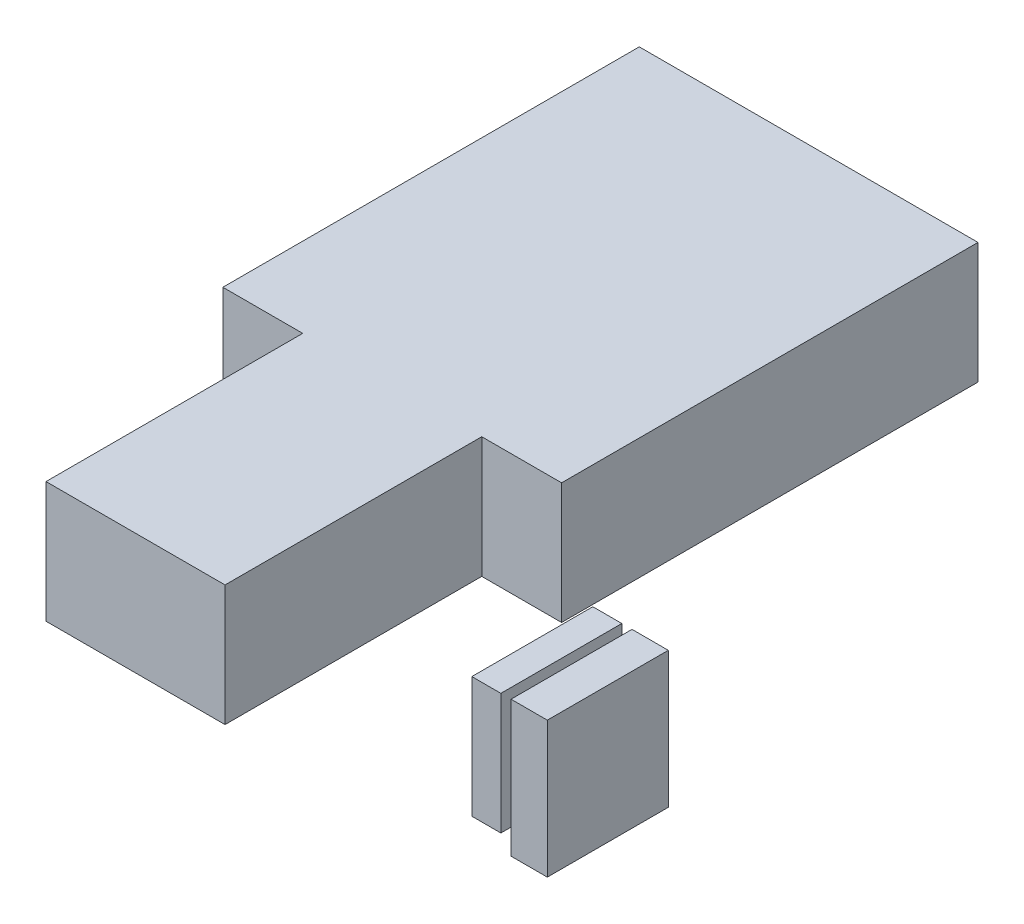
ISO-10303-21;
HEADER;
FILE_DESCRIPTION(('STEP AP214'),'2;1');
FILE_NAME('part.step','',(''),(''),'','','');
FILE_SCHEMA(('AUTOMOTIVE_DESIGN { 1 0 10303 214 1 1 1 1 }'));
ENDSEC;
DATA;
#1=APPLICATION_CONTEXT('core data for automotive mechanical design processes');
#2=APPLICATION_PROTOCOL_DEFINITION('international standard','automotive_design',2000,#1);
#3=PRODUCT_CONTEXT('',#1,'mechanical');
#4=PRODUCT('Part','Part','',(#3));
#5=PRODUCT_RELATED_PRODUCT_CATEGORY('part','',(#4));
#6=PRODUCT_DEFINITION_FORMATION('','',#4);
#7=PRODUCT_DEFINITION_CONTEXT('part definition',#1,'design');
#8=PRODUCT_DEFINITION('design','',#6,#7);
#9=PRODUCT_DEFINITION_SHAPE('','',#8);
#10=(LENGTH_UNIT() NAMED_UNIT(*) SI_UNIT(.MILLI.,.METRE.));
#11=(NAMED_UNIT(*) PLANE_ANGLE_UNIT() SI_UNIT($,.RADIAN.));
#12=(NAMED_UNIT(*) SI_UNIT($,.STERADIAN.) SOLID_ANGLE_UNIT());
#13=UNCERTAINTY_MEASURE_WITH_UNIT(LENGTH_MEASURE(1.E-05),#10,'distance_accuracy_value','');
#14=(GEOMETRIC_REPRESENTATION_CONTEXT(3) GLOBAL_UNCERTAINTY_ASSIGNED_CONTEXT((#13)) GLOBAL_UNIT_ASSIGNED_CONTEXT((#10,
#11,#12)) REPRESENTATION_CONTEXT('',''));
#15=CARTESIAN_POINT('',(0.,0.,0.));
#16=DIRECTION('',(0.,0.,1.));
#17=DIRECTION('',(1.,0.,0.));
#18=AXIS2_PLACEMENT_3D('',#15,#16,#17);
#19=CARTESIAN_POINT('',(-98.5,9.39999999999999,-34.55));
#20=DIRECTION('',(1.,0.,0.));
#21=DIRECTION('',(0.,0.,-1.));
#22=AXIS2_PLACEMENT_3D('',#19,#20,#21);
#23=PLANE('',#22);
#24=DIRECTION('',(0.,0.,1.));
#25=VECTOR('',#24,1.);
#26=CARTESIAN_POINT('',(-98.5,-15.6,-34.55));
#27=LINE('',#26,#25);
#28=CARTESIAN_POINT('',(-98.5,-15.6,-120.6));
#29=VERTEX_POINT('',#28);
#30=CARTESIAN_POINT('',(-98.5,-15.6,-34.55));
#31=VERTEX_POINT('',#30);
#32=EDGE_CURVE('E141',#29,#31,#27,.T.);
#33=ORIENTED_EDGE('',*,*,#32,.T.);
#34=DIRECTION('',(0.,-1.,0.));
#35=VECTOR('',#34,1.);
#36=CARTESIAN_POINT('',(-98.5,9.39999999999999,-34.55));
#37=LINE('',#36,#35);
#38=CARTESIAN_POINT('',(-98.5,9.39999999999999,-34.55));
#39=VERTEX_POINT('',#38);
#40=EDGE_CURVE('E12',#39,#31,#37,.T.);
#41=ORIENTED_EDGE('',*,*,#40,.F.);
#42=DIRECTION('',(0.,0.,1.));
#43=VECTOR('',#42,1.);
#44=CARTESIAN_POINT('',(-98.5,9.39999999999999,-34.55));
#45=LINE('',#44,#43);
#46=CARTESIAN_POINT('',(-98.5,9.39999999999999,-120.6));
#47=VERTEX_POINT('',#46);
#48=EDGE_CURVE('E155',#47,#39,#45,.T.);
#49=ORIENTED_EDGE('',*,*,#48,.F.);
#50=DIRECTION('',(0.,-1.,0.));
#51=VECTOR('',#50,1.);
#52=CARTESIAN_POINT('',(-98.5,9.39999999999999,-120.6));
#53=LINE('',#52,#51);
#54=EDGE_CURVE('E137',#47,#29,#53,.T.);
#55=ORIENTED_EDGE('',*,*,#54,.T.);
#56=EDGE_LOOP('',(#33,#41,#49,#55));
#57=FACE_BOUND('',#56,.T.);
#58=ADVANCED_FACE('F45',(#57),#23,.F.);
#59=CARTESIAN_POINT('',(-82.,9.39999999999999,-34.55));
#60=DIRECTION('',(0.,0.,-1.));
#61=DIRECTION('',(-1.,0.,0.));
#62=AXIS2_PLACEMENT_3D('',#59,#60,#61);
#63=PLANE('',#62);
#64=DIRECTION('',(1.,0.,0.));
#65=VECTOR('',#64,1.);
#66=CARTESIAN_POINT('',(-82.,-15.6,-34.55));
#67=LINE('',#66,#65);
#68=CARTESIAN_POINT('',(-82.,-15.6,-34.55));
#69=VERTEX_POINT('',#68);
#70=EDGE_CURVE('E144',#31,#69,#67,.T.);
#71=ORIENTED_EDGE('',*,*,#70,.T.);
#72=DIRECTION('',(0.,-1.,0.));
#73=VECTOR('',#72,1.);
#74=CARTESIAN_POINT('',(-82.,9.39999999999999,-34.55));
#75=LINE('',#74,#73);
#76=CARTESIAN_POINT('',(-82.,9.39999999999999,-34.55));
#77=VERTEX_POINT('',#76);
#78=EDGE_CURVE('E53',#77,#69,#75,.T.);
#79=ORIENTED_EDGE('',*,*,#78,.F.);
#80=DIRECTION('',(1.,0.,0.));
#81=VECTOR('',#80,1.);
#82=CARTESIAN_POINT('',(-82.,9.39999999999999,-34.55));
#83=LINE('',#82,#81);
#84=EDGE_CURVE('E104',#39,#77,#83,.T.);
#85=ORIENTED_EDGE('',*,*,#84,.F.);
#86=ORIENTED_EDGE('',*,*,#40,.T.);
#87=EDGE_LOOP('',(#71,#79,#85,#86));
#88=FACE_BOUND('',#87,.T.);
#89=ADVANCED_FACE('F190',(#88),#63,.F.);
#90=CARTESIAN_POINT('',(-82.,9.39999999999999,18.5));
#91=DIRECTION('',(1.,0.,0.));
#92=DIRECTION('',(0.,0.,-1.));
#93=AXIS2_PLACEMENT_3D('',#90,#91,#92);
#94=PLANE('',#93);
#95=DIRECTION('',(0.,0.,1.));
#96=VECTOR('',#95,1.);
#97=CARTESIAN_POINT('',(-82.,-15.6,18.5));
#98=LINE('',#97,#96);
#99=CARTESIAN_POINT('',(-82.,-15.6,18.5));
#100=VERTEX_POINT('',#99);
#101=EDGE_CURVE('E146',#69,#100,#98,.T.);
#102=ORIENTED_EDGE('',*,*,#101,.T.);
#103=DIRECTION('',(0.,-1.,0.));
#104=VECTOR('',#103,1.);
#105=CARTESIAN_POINT('',(-82.,9.39999999999999,18.5));
#106=LINE('',#105,#104);
#107=CARTESIAN_POINT('',(-82.,9.39999999999999,18.5));
#108=VERTEX_POINT('',#107);
#109=EDGE_CURVE('E162',#108,#100,#106,.T.);
#110=ORIENTED_EDGE('',*,*,#109,.F.);
#111=DIRECTION('',(0.,0.,1.));
#112=VECTOR('',#111,1.);
#113=CARTESIAN_POINT('',(-82.,9.39999999999999,18.5));
#114=LINE('',#113,#112);
#115=EDGE_CURVE('E170',#77,#108,#114,.T.);
#116=ORIENTED_EDGE('',*,*,#115,.F.);
#117=ORIENTED_EDGE('',*,*,#78,.T.);
#118=EDGE_LOOP('',(#102,#110,#116,#117));
#119=FACE_BOUND('',#118,.T.);
#120=ADVANCED_FACE('F168',(#119),#94,.F.);
#121=CARTESIAN_POINT('',(-45.,9.39999999999999,18.5));
#122=DIRECTION('',(0.,0.,-1.));
#123=DIRECTION('',(-1.,0.,0.));
#124=AXIS2_PLACEMENT_3D('',#121,#122,#123);
#125=PLANE('',#124);
#126=DIRECTION('',(1.,0.,0.));
#127=VECTOR('',#126,1.);
#128=CARTESIAN_POINT('',(-45.,-15.6,18.5));
#129=LINE('',#128,#127);
#130=CARTESIAN_POINT('',(-45.,-15.6,18.5));
#131=VERTEX_POINT('',#130);
#132=EDGE_CURVE('E148',#100,#131,#129,.T.);
#133=ORIENTED_EDGE('',*,*,#132,.T.);
#134=DIRECTION('',(0.,-1.,0.));
#135=VECTOR('',#134,1.);
#136=CARTESIAN_POINT('',(-45.,9.39999999999999,18.5));
#137=LINE('',#136,#135);
#138=CARTESIAN_POINT('',(-45.,9.39999999999999,18.5));
#139=VERTEX_POINT('',#138);
#140=EDGE_CURVE('E159',#139,#131,#137,.T.);
#141=ORIENTED_EDGE('',*,*,#140,.F.);
#142=DIRECTION('',(1.,0.,0.));
#143=VECTOR('',#142,1.);
#144=CARTESIAN_POINT('',(-45.,9.39999999999999,18.5));
#145=LINE('',#144,#143);
#146=EDGE_CURVE('E182',#108,#139,#145,.T.);
#147=ORIENTED_EDGE('',*,*,#146,.F.);
#148=ORIENTED_EDGE('',*,*,#109,.T.);
#149=EDGE_LOOP('',(#133,#141,#147,#148));
#150=FACE_BOUND('',#149,.T.);
#151=ADVANCED_FACE('F178',(#150),#125,.F.);
#152=CARTESIAN_POINT('',(-45.,9.39999999999999,-34.55));
#153=DIRECTION('',(-1.,0.,0.));
#154=DIRECTION('',(0.,0.,1.));
#155=AXIS2_PLACEMENT_3D('',#152,#153,#154);
#156=PLANE('',#155);
#157=DIRECTION('',(0.,0.,-1.));
#158=VECTOR('',#157,1.);
#159=CARTESIAN_POINT('',(-45.,-15.6,-34.55));
#160=LINE('',#159,#158);
#161=CARTESIAN_POINT('',(-45.,-15.6,-34.55));
#162=VERTEX_POINT('',#161);
#163=EDGE_CURVE('E150',#131,#162,#160,.T.);
#164=ORIENTED_EDGE('',*,*,#163,.T.);
#165=DIRECTION('',(0.,-1.,0.));
#166=VECTOR('',#165,1.);
#167=CARTESIAN_POINT('',(-45.,9.39999999999999,-34.55));
#168=LINE('',#167,#166);
#169=CARTESIAN_POINT('',(-45.,9.39999999999999,-34.55));
#170=VERTEX_POINT('',#169);
#171=EDGE_CURVE('E132',#170,#162,#168,.T.);
#172=ORIENTED_EDGE('',*,*,#171,.F.);
#173=DIRECTION('',(0.,0.,-1.));
#174=VECTOR('',#173,1.);
#175=CARTESIAN_POINT('',(-45.,9.39999999999999,-34.55));
#176=LINE('',#175,#174);
#177=EDGE_CURVE('E123',#139,#170,#176,.T.);
#178=ORIENTED_EDGE('',*,*,#177,.F.);
#179=ORIENTED_EDGE('',*,*,#140,.T.);
#180=EDGE_LOOP('',(#164,#172,#178,#179));
#181=FACE_BOUND('',#180,.T.);
#182=ADVANCED_FACE('F181',(#181),#156,.F.);
#183=CARTESIAN_POINT('',(-28.5,9.39999999999999,-34.55));
#184=DIRECTION('',(0.,0.,-1.));
#185=DIRECTION('',(-1.,0.,0.));
#186=AXIS2_PLACEMENT_3D('',#183,#184,#185);
#187=PLANE('',#186);
#188=DIRECTION('',(1.,0.,0.));
#189=VECTOR('',#188,1.);
#190=CARTESIAN_POINT('',(-28.5,-15.6,-34.55));
#191=LINE('',#190,#189);
#192=CARTESIAN_POINT('',(-28.5,-15.6,-34.55));
#193=VERTEX_POINT('',#192);
#194=EDGE_CURVE('E131',#162,#193,#191,.T.);
#195=ORIENTED_EDGE('',*,*,#194,.T.);
#196=DIRECTION('',(0.,-1.,0.));
#197=VECTOR('',#196,1.);
#198=CARTESIAN_POINT('',(-28.5,9.39999999999999,-34.55));
#199=LINE('',#198,#197);
#200=CARTESIAN_POINT('',(-28.5,9.39999999999999,-34.55));
#201=VERTEX_POINT('',#200);
#202=EDGE_CURVE('E128',#201,#193,#199,.T.);
#203=ORIENTED_EDGE('',*,*,#202,.F.);
#204=DIRECTION('',(1.,0.,0.));
#205=VECTOR('',#204,1.);
#206=CARTESIAN_POINT('',(-28.5,9.39999999999999,-34.55));
#207=LINE('',#206,#205);
#208=EDGE_CURVE('E117',#170,#201,#207,.T.);
#209=ORIENTED_EDGE('',*,*,#208,.F.);
#210=ORIENTED_EDGE('',*,*,#171,.T.);
#211=EDGE_LOOP('',(#195,#203,#209,#210));
#212=FACE_BOUND('',#211,.T.);
#213=ADVANCED_FACE('F129',(#212),#187,.F.);
#214=CARTESIAN_POINT('',(-28.5,9.39999999999999,-120.6));
#215=DIRECTION('',(-1.,0.,0.));
#216=DIRECTION('',(0.,0.,1.));
#217=AXIS2_PLACEMENT_3D('',#214,#215,#216);
#218=PLANE('',#217);
#219=DIRECTION('',(0.,0.,-1.));
#220=VECTOR('',#219,1.);
#221=CARTESIAN_POINT('',(-28.5,-15.6,-120.6));
#222=LINE('',#221,#220);
#223=CARTESIAN_POINT('',(-28.5,-15.6,-120.6));
#224=VERTEX_POINT('',#223);
#225=EDGE_CURVE('E90',#193,#224,#222,.T.);
#226=ORIENTED_EDGE('',*,*,#225,.T.);
#227=DIRECTION('',(0.,-1.,0.));
#228=VECTOR('',#227,1.);
#229=CARTESIAN_POINT('',(-28.5,9.39999999999999,-120.6));
#230=LINE('',#229,#228);
#231=CARTESIAN_POINT('',(-28.5,9.39999999999999,-120.6));
#232=VERTEX_POINT('',#231);
#233=EDGE_CURVE('E133',#232,#224,#230,.T.);
#234=ORIENTED_EDGE('',*,*,#233,.F.);
#235=DIRECTION('',(0.,0.,-1.));
#236=VECTOR('',#235,1.);
#237=CARTESIAN_POINT('',(-28.5,9.39999999999999,-120.6));
#238=LINE('',#237,#236);
#239=EDGE_CURVE('E121',#201,#232,#238,.T.);
#240=ORIENTED_EDGE('',*,*,#239,.F.);
#241=ORIENTED_EDGE('',*,*,#202,.T.);
#242=EDGE_LOOP('',(#226,#234,#240,#241));
#243=FACE_BOUND('',#242,.T.);
#244=ADVANCED_FACE('F135',(#243),#218,.F.);
#245=CARTESIAN_POINT('',(-98.5,9.39999999999999,-120.6));
#246=DIRECTION('',(0.,0.,1.));
#247=DIRECTION('',(1.,0.,0.));
#248=AXIS2_PLACEMENT_3D('',#245,#246,#247);
#249=PLANE('',#248);
#250=DIRECTION('',(-1.,0.,0.));
#251=VECTOR('',#250,1.);
#252=CARTESIAN_POINT('',(-98.5,-15.6,-120.6));
#253=LINE('',#252,#251);
#254=EDGE_CURVE('E96',#224,#29,#253,.T.);
#255=ORIENTED_EDGE('',*,*,#254,.T.);
#256=ORIENTED_EDGE('',*,*,#54,.F.);
#257=DIRECTION('',(-1.,0.,0.));
#258=VECTOR('',#257,1.);
#259=CARTESIAN_POINT('',(-98.5,9.39999999999999,-120.6));
#260=LINE('',#259,#258);
#261=EDGE_CURVE('E61',#232,#47,#260,.T.);
#262=ORIENTED_EDGE('',*,*,#261,.F.);
#263=ORIENTED_EDGE('',*,*,#233,.T.);
#264=EDGE_LOOP('',(#255,#256,#262,#263));
#265=FACE_BOUND('',#264,.T.);
#266=ADVANCED_FACE('F206',(#265),#249,.F.);
#267=CARTESIAN_POINT('',(0.,9.39999999999999,0.));
#268=DIRECTION('',(0.,-1.,0.));
#269=DIRECTION('',(0.,0.,-1.));
#270=AXIS2_PLACEMENT_3D('',#267,#268,#269);
#271=PLANE('',#270);
#272=ORIENTED_EDGE('',*,*,#48,.T.);
#273=ORIENTED_EDGE('',*,*,#84,.T.);
#274=ORIENTED_EDGE('',*,*,#115,.T.);
#275=ORIENTED_EDGE('',*,*,#146,.T.);
#276=ORIENTED_EDGE('',*,*,#177,.T.);
#277=ORIENTED_EDGE('',*,*,#208,.T.);
#278=ORIENTED_EDGE('',*,*,#239,.T.);
#279=ORIENTED_EDGE('',*,*,#261,.T.);
#280=EDGE_LOOP('',(#272,#273,#274,#275,#276,#277,#278,#279));
#281=FACE_BOUND('',#280,.T.);
#282=ADVANCED_FACE('F119',(#281),#271,.F.);
#283=CARTESIAN_POINT('',(0.,-15.6,0.));
#284=DIRECTION('',(0.,-1.,0.));
#285=DIRECTION('',(0.,0.,-1.));
#286=AXIS2_PLACEMENT_3D('',#283,#284,#285);
#287=PLANE('',#286);
#288=ORIENTED_EDGE('',*,*,#32,.F.);
#289=ORIENTED_EDGE('',*,*,#254,.F.);
#290=ORIENTED_EDGE('',*,*,#225,.F.);
#291=ORIENTED_EDGE('',*,*,#194,.F.);
#292=ORIENTED_EDGE('',*,*,#163,.F.);
#293=ORIENTED_EDGE('',*,*,#132,.F.);
#294=ORIENTED_EDGE('',*,*,#101,.F.);
#295=ORIENTED_EDGE('',*,*,#70,.F.);
#296=EDGE_LOOP('',(#288,#289,#290,#291,#292,#293,#294,#295));
#297=FACE_BOUND('',#296,.T.);
#298=ADVANCED_FACE('F174',(#297),#287,.T.);
#299=CLOSED_SHELL('',(#58,#89,#120,#151,#182,#213,#244,#266,#282,#298));
#300=MANIFOLD_SOLID_BREP('B2',#299);
#301=CARTESIAN_POINT('',(8.1,-15.6,-12.5));
#302=DIRECTION('',(0.,0.,1.));
#303=DIRECTION('',(1.,0.,0.));
#304=AXIS2_PLACEMENT_3D('',#301,#302,#303);
#305=PLANE('',#304);
#306=DIRECTION('',(0.,-1.,0.));
#307=VECTOR('',#306,1.);
#308=CARTESIAN_POINT('',(15.6,-15.6,-12.5));
#309=LINE('',#308,#307);
#310=CARTESIAN_POINT('',(15.6,12.5,-12.5));
#311=VERTEX_POINT('',#310);
#312=CARTESIAN_POINT('',(15.6,-15.6,-12.5));
#313=VERTEX_POINT('',#312);
#314=EDGE_CURVE('E344',#311,#313,#309,.T.);
#315=ORIENTED_EDGE('',*,*,#314,.T.);
#316=DIRECTION('',(1.,0.,0.));
#317=VECTOR('',#316,1.);
#318=CARTESIAN_POINT('',(8.1,-15.6,-12.5));
#319=LINE('',#318,#317);
#320=CARTESIAN_POINT('',(8.1,-15.6,-12.5));
#321=VERTEX_POINT('',#320);
#322=EDGE_CURVE('E43',#321,#313,#319,.T.);
#323=ORIENTED_EDGE('',*,*,#322,.F.);
#324=DIRECTION('',(0.,-1.,0.));
#325=VECTOR('',#324,1.);
#326=CARTESIAN_POINT('',(8.1,-15.6,-12.5));
#327=LINE('',#326,#325);
#328=CARTESIAN_POINT('',(8.1,12.5,-12.5));
#329=VERTEX_POINT('',#328);
#330=EDGE_CURVE('E332',#329,#321,#327,.T.);
#331=ORIENTED_EDGE('',*,*,#330,.F.);
#332=DIRECTION('',(1.,0.,0.));
#333=VECTOR('',#332,1.);
#334=CARTESIAN_POINT('',(8.1,12.5,-12.5));
#335=LINE('',#334,#333);
#336=EDGE_CURVE('E340',#329,#311,#335,.T.);
#337=ORIENTED_EDGE('',*,*,#336,.T.);
#338=EDGE_LOOP('',(#315,#323,#331,#337));
#339=FACE_BOUND('',#338,.T.);
#340=ADVANCED_FACE('F281',(#339),#305,.F.);
#341=CARTESIAN_POINT('',(8.1,-15.6,12.5));
#342=DIRECTION('',(0.,1.,0.));
#343=DIRECTION('',(0.,0.,1.));
#344=AXIS2_PLACEMENT_3D('',#341,#342,#343);
#345=PLANE('',#344);
#346=DIRECTION('',(0.,0.,1.));
#347=VECTOR('',#346,1.);
#348=CARTESIAN_POINT('',(15.6,-15.6,12.5));
#349=LINE('',#348,#347);
#350=CARTESIAN_POINT('',(15.6,-15.6,12.5));
#351=VERTEX_POINT('',#350);
#352=EDGE_CURVE('E336',#313,#351,#349,.T.);
#353=ORIENTED_EDGE('',*,*,#352,.T.);
#354=DIRECTION('',(1.,0.,0.));
#355=VECTOR('',#354,1.);
#356=CARTESIAN_POINT('',(8.1,-15.6,12.5));
#357=LINE('',#356,#355);
#358=CARTESIAN_POINT('',(8.1,-15.6,12.5));
#359=VERTEX_POINT('',#358);
#360=EDGE_CURVE('E289',#359,#351,#357,.T.);
#361=ORIENTED_EDGE('',*,*,#360,.F.);
#362=DIRECTION('',(0.,0.,1.));
#363=VECTOR('',#362,1.);
#364=CARTESIAN_POINT('',(8.1,-15.6,12.5));
#365=LINE('',#364,#363);
#366=EDGE_CURVE('E327',#321,#359,#365,.T.);
#367=ORIENTED_EDGE('',*,*,#366,.F.);
#368=ORIENTED_EDGE('',*,*,#322,.T.);
#369=EDGE_LOOP('',(#353,#361,#367,#368));
#370=FACE_BOUND('',#369,.T.);
#371=ADVANCED_FACE('F335',(#370),#345,.F.);
#372=CARTESIAN_POINT('',(8.1,12.5,12.5));
#373=DIRECTION('',(0.,0.,-1.));
#374=DIRECTION('',(0.,1.,0.));
#375=AXIS2_PLACEMENT_3D('',#372,#373,#374);
#376=PLANE('',#375);
#377=DIRECTION('',(0.,1.,0.));
#378=VECTOR('',#377,1.);
#379=CARTESIAN_POINT('',(15.6,12.5,12.5));
#380=LINE('',#379,#378);
#381=CARTESIAN_POINT('',(15.6,12.5,12.5));
#382=VERTEX_POINT('',#381);
#383=EDGE_CURVE('E314',#351,#382,#380,.T.);
#384=ORIENTED_EDGE('',*,*,#383,.T.);
#385=DIRECTION('',(1.,0.,0.));
#386=VECTOR('',#385,1.);
#387=CARTESIAN_POINT('',(8.1,12.5,12.5));
#388=LINE('',#387,#386);
#389=CARTESIAN_POINT('',(8.1,12.5,12.5));
#390=VERTEX_POINT('',#389);
#391=EDGE_CURVE('E337',#390,#382,#388,.T.);
#392=ORIENTED_EDGE('',*,*,#391,.F.);
#393=DIRECTION('',(0.,1.,0.));
#394=VECTOR('',#393,1.);
#395=CARTESIAN_POINT('',(8.1,12.5,12.5));
#396=LINE('',#395,#394);
#397=EDGE_CURVE('E330',#359,#390,#396,.T.);
#398=ORIENTED_EDGE('',*,*,#397,.F.);
#399=ORIENTED_EDGE('',*,*,#360,.T.);
#400=EDGE_LOOP('',(#384,#392,#398,#399));
#401=FACE_BOUND('',#400,.T.);
#402=ADVANCED_FACE('F338',(#401),#376,.F.);
#403=CARTESIAN_POINT('',(8.1,12.5,-12.5));
#404=DIRECTION('',(0.,-1.,0.));
#405=DIRECTION('',(0.,0.,-1.));
#406=AXIS2_PLACEMENT_3D('',#403,#404,#405);
#407=PLANE('',#406);
#408=DIRECTION('',(0.,0.,-1.));
#409=VECTOR('',#408,1.);
#410=CARTESIAN_POINT('',(15.6,12.5,-12.5));
#411=LINE('',#410,#409);
#412=EDGE_CURVE('E320',#382,#311,#411,.T.);
#413=ORIENTED_EDGE('',*,*,#412,.T.);
#414=ORIENTED_EDGE('',*,*,#336,.F.);
#415=DIRECTION('',(0.,0.,-1.));
#416=VECTOR('',#415,1.);
#417=CARTESIAN_POINT('',(8.1,12.5,-12.5));
#418=LINE('',#417,#416);
#419=EDGE_CURVE('E297',#390,#329,#418,.T.);
#420=ORIENTED_EDGE('',*,*,#419,.F.);
#421=ORIENTED_EDGE('',*,*,#391,.T.);
#422=EDGE_LOOP('',(#413,#414,#420,#421));
#423=FACE_BOUND('',#422,.T.);
#424=ADVANCED_FACE('F351',(#423),#407,.F.);
#425=CARTESIAN_POINT('',(8.1,0.,0.));
#426=DIRECTION('',(1.,0.,0.));
#427=DIRECTION('',(0.,0.,-1.));
#428=AXIS2_PLACEMENT_3D('',#425,#426,#427);
#429=PLANE('',#428);
#430=ORIENTED_EDGE('',*,*,#330,.T.);
#431=ORIENTED_EDGE('',*,*,#366,.T.);
#432=ORIENTED_EDGE('',*,*,#397,.T.);
#433=ORIENTED_EDGE('',*,*,#419,.T.);
#434=EDGE_LOOP('',(#430,#431,#432,#433));
#435=FACE_BOUND('',#434,.T.);
#436=ADVANCED_FACE('F328',(#435),#429,.F.);
#437=CARTESIAN_POINT('',(15.6,0.,0.));
#438=DIRECTION('',(1.,0.,0.));
#439=DIRECTION('',(0.,0.,-1.));
#440=AXIS2_PLACEMENT_3D('',#437,#438,#439);
#441=PLANE('',#440);
#442=ORIENTED_EDGE('',*,*,#314,.F.);
#443=ORIENTED_EDGE('',*,*,#412,.F.);
#444=ORIENTED_EDGE('',*,*,#383,.F.);
#445=ORIENTED_EDGE('',*,*,#352,.F.);
#446=EDGE_LOOP('',(#442,#443,#444,#445));
#447=FACE_BOUND('',#446,.T.);
#448=ADVANCED_FACE('F354',(#447),#441,.T.);
#449=CLOSED_SHELL('',(#340,#371,#402,#424,#436,#448));
#450=MANIFOLD_SOLID_BREP('B6_NOT_SHOWN',#449);
#451=CARTESIAN_POINT('',(6.,12.5,-12.5));
#452=DIRECTION('',(0.,0.,1.));
#453=DIRECTION('',(0.,-1.,0.));
#454=AXIS2_PLACEMENT_3D('',#451,#452,#453);
#455=PLANE('',#454);
#456=DIRECTION('',(0.,1.,0.));
#457=VECTOR('',#456,1.);
#458=CARTESIAN_POINT('',(0.,12.5,-12.5));
#459=LINE('',#458,#457);
#460=CARTESIAN_POINT('',(0.,-12.5,-12.5));
#461=VERTEX_POINT('',#460);
#462=CARTESIAN_POINT('',(0.,12.5,-12.5));
#463=VERTEX_POINT('',#462);
#464=EDGE_CURVE('E467',#461,#463,#459,.T.);
#465=ORIENTED_EDGE('',*,*,#464,.T.);
#466=DIRECTION('',(-1.,0.,0.));
#467=VECTOR('',#466,1.);
#468=CARTESIAN_POINT('',(6.,12.5,-12.5));
#469=LINE('',#468,#467);
#470=CARTESIAN_POINT('',(6.,12.5,-12.5));
#471=VERTEX_POINT('',#470);
#472=EDGE_CURVE('E279',#471,#463,#469,.T.);
#473=ORIENTED_EDGE('',*,*,#472,.F.);
#474=DIRECTION('',(0.,1.,0.));
#475=VECTOR('',#474,1.);
#476=CARTESIAN_POINT('',(6.,12.5,-12.5));
#477=LINE('',#476,#475);
#478=CARTESIAN_POINT('',(6.,-12.5,-12.5));
#479=VERTEX_POINT('',#478);
#480=EDGE_CURVE('E455',#479,#471,#477,.T.);
#481=ORIENTED_EDGE('',*,*,#480,.F.);
#482=DIRECTION('',(-1.,0.,0.));
#483=VECTOR('',#482,1.);
#484=CARTESIAN_POINT('',(6.,-12.5,-12.5));
#485=LINE('',#484,#483);
#486=EDGE_CURVE('E463',#479,#461,#485,.T.);
#487=ORIENTED_EDGE('',*,*,#486,.T.);
#488=EDGE_LOOP('',(#465,#473,#481,#487));
#489=FACE_BOUND('',#488,.T.);
#490=ADVANCED_FACE('F404',(#489),#455,.F.);
#491=CARTESIAN_POINT('',(6.,12.5,12.5));
#492=DIRECTION('',(0.,-1.,0.));
#493=DIRECTION('',(0.,0.,-1.));
#494=AXIS2_PLACEMENT_3D('',#491,#492,#493);
#495=PLANE('',#494);
#496=DIRECTION('',(0.,0.,1.));
#497=VECTOR('',#496,1.);
#498=CARTESIAN_POINT('',(0.,12.5,12.5));
#499=LINE('',#498,#497);
#500=CARTESIAN_POINT('',(0.,12.5,12.5));
#501=VERTEX_POINT('',#500);
#502=EDGE_CURVE('E459',#463,#501,#499,.T.);
#503=ORIENTED_EDGE('',*,*,#502,.T.);
#504=DIRECTION('',(-1.,0.,0.));
#505=VECTOR('',#504,1.);
#506=CARTESIAN_POINT('',(6.,12.5,12.5));
#507=LINE('',#506,#505);
#508=CARTESIAN_POINT('',(6.,12.5,12.5));
#509=VERTEX_POINT('',#508);
#510=EDGE_CURVE('E412',#509,#501,#507,.T.);
#511=ORIENTED_EDGE('',*,*,#510,.F.);
#512=DIRECTION('',(0.,0.,1.));
#513=VECTOR('',#512,1.);
#514=CARTESIAN_POINT('',(6.,12.5,12.5));
#515=LINE('',#514,#513);
#516=EDGE_CURVE('E450',#471,#509,#515,.T.);
#517=ORIENTED_EDGE('',*,*,#516,.F.);
#518=ORIENTED_EDGE('',*,*,#472,.T.);
#519=EDGE_LOOP('',(#503,#511,#517,#518));
#520=FACE_BOUND('',#519,.T.);
#521=ADVANCED_FACE('F458',(#520),#495,.F.);
#522=CARTESIAN_POINT('',(6.,12.5,12.5));
#523=DIRECTION('',(0.,0.,-1.));
#524=DIRECTION('',(0.,1.,0.));
#525=AXIS2_PLACEMENT_3D('',#522,#523,#524);
#526=PLANE('',#525);
#527=DIRECTION('',(0.,-1.,0.));
#528=VECTOR('',#527,1.);
#529=CARTESIAN_POINT('',(0.,12.5,12.5));
#530=LINE('',#529,#528);
#531=CARTESIAN_POINT('',(0.,-12.5,12.5));
#532=VERTEX_POINT('',#531);
#533=EDGE_CURVE('E437',#501,#532,#530,.T.);
#534=ORIENTED_EDGE('',*,*,#533,.T.);
#535=DIRECTION('',(-1.,0.,0.));
#536=VECTOR('',#535,1.);
#537=CARTESIAN_POINT('',(6.,-12.5,12.5));
#538=LINE('',#537,#536);
#539=CARTESIAN_POINT('',(6.,-12.5,12.5));
#540=VERTEX_POINT('',#539);
#541=EDGE_CURVE('E460',#540,#532,#538,.T.);
#542=ORIENTED_EDGE('',*,*,#541,.F.);
#543=DIRECTION('',(0.,-1.,0.));
#544=VECTOR('',#543,1.);
#545=CARTESIAN_POINT('',(6.,12.5,12.5));
#546=LINE('',#545,#544);
#547=EDGE_CURVE('E453',#509,#540,#546,.T.);
#548=ORIENTED_EDGE('',*,*,#547,.F.);
#549=ORIENTED_EDGE('',*,*,#510,.T.);
#550=EDGE_LOOP('',(#534,#542,#548,#549));
#551=FACE_BOUND('',#550,.T.);
#552=ADVANCED_FACE('F461',(#551),#526,.F.);
#553=CARTESIAN_POINT('',(6.,-12.5,12.5));
#554=DIRECTION('',(0.,1.,0.));
#555=DIRECTION('',(0.,0.,1.));
#556=AXIS2_PLACEMENT_3D('',#553,#554,#555);
#557=PLANE('',#556);
#558=DIRECTION('',(0.,0.,-1.));
#559=VECTOR('',#558,1.);
#560=CARTESIAN_POINT('',(0.,-12.5,12.5));
#561=LINE('',#560,#559);
#562=EDGE_CURVE('E443',#532,#461,#561,.T.);
#563=ORIENTED_EDGE('',*,*,#562,.T.);
#564=ORIENTED_EDGE('',*,*,#486,.F.);
#565=DIRECTION('',(0.,0.,-1.));
#566=VECTOR('',#565,1.);
#567=CARTESIAN_POINT('',(6.,-12.5,12.5));
#568=LINE('',#567,#566);
#569=EDGE_CURVE('E420',#540,#479,#568,.T.);
#570=ORIENTED_EDGE('',*,*,#569,.F.);
#571=ORIENTED_EDGE('',*,*,#541,.T.);
#572=EDGE_LOOP('',(#563,#564,#570,#571));
#573=FACE_BOUND('',#572,.T.);
#574=ADVANCED_FACE('F474',(#573),#557,.F.);
#575=CARTESIAN_POINT('',(6.,0.,0.));
#576=DIRECTION('',(1.,0.,0.));
#577=DIRECTION('',(0.,0.,-1.));
#578=AXIS2_PLACEMENT_3D('',#575,#576,#577);
#579=PLANE('',#578);
#580=ORIENTED_EDGE('',*,*,#480,.T.);
#581=ORIENTED_EDGE('',*,*,#516,.T.);
#582=ORIENTED_EDGE('',*,*,#547,.T.);
#583=ORIENTED_EDGE('',*,*,#569,.T.);
#584=EDGE_LOOP('',(#580,#581,#582,#583));
#585=FACE_BOUND('',#584,.T.);
#586=ADVANCED_FACE('F451',(#585),#579,.T.);
#587=CARTESIAN_POINT('',(0.,0.,0.));
#588=DIRECTION('',(1.,0.,0.));
#589=DIRECTION('',(0.,0.,-1.));
#590=AXIS2_PLACEMENT_3D('',#587,#588,#589);
#591=PLANE('',#590);
#592=ORIENTED_EDGE('',*,*,#464,.F.);
#593=ORIENTED_EDGE('',*,*,#562,.F.);
#594=ORIENTED_EDGE('',*,*,#533,.F.);
#595=ORIENTED_EDGE('',*,*,#502,.F.);
#596=EDGE_LOOP('',(#592,#593,#594,#595));
#597=FACE_BOUND('',#596,.T.);
#598=ADVANCED_FACE('F477',(#597),#591,.F.);
#599=CLOSED_SHELL('',(#490,#521,#552,#574,#586,#598));
#600=MANIFOLD_SOLID_BREP('B37_NOT_SHOWN',#599);
#601=ADVANCED_BREP_SHAPE_REPRESENTATION('',(#18,#300,#450,#600),#14);
#602=SHAPE_DEFINITION_REPRESENTATION(#9,#601);
ENDSEC;
END-ISO-10303-21;
